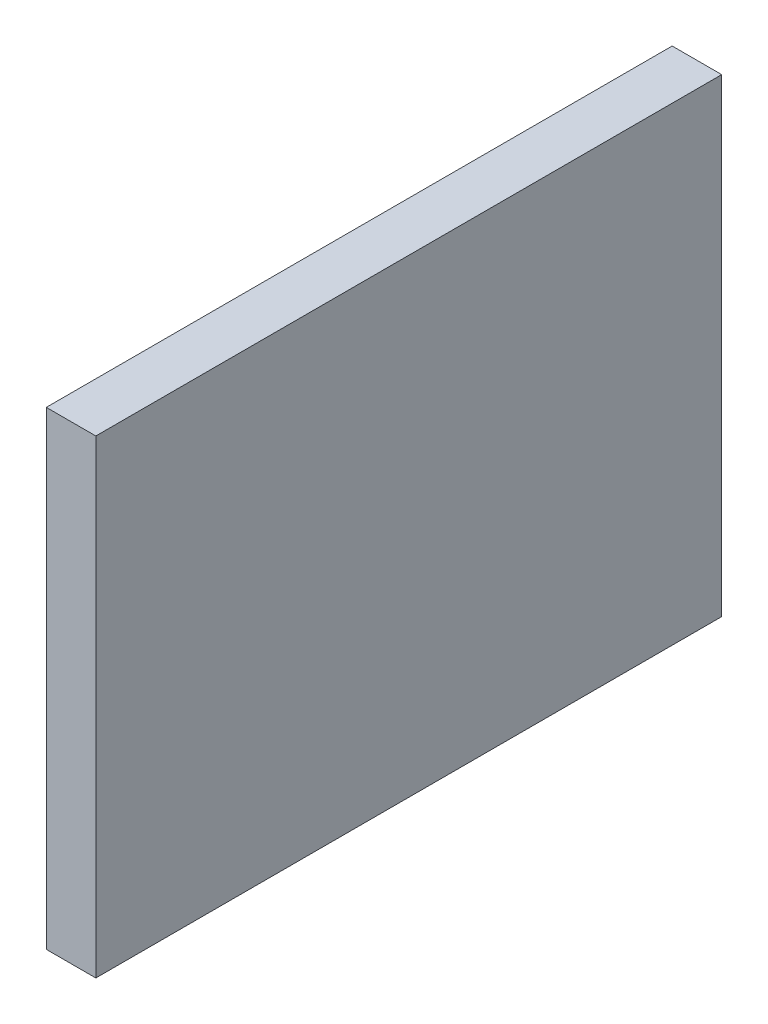
ISO-10303-21;
HEADER;
FILE_DESCRIPTION(('STEP AP214'),'2;1');
FILE_NAME('part.step','',(''),(''),'','','');
FILE_SCHEMA(('AUTOMOTIVE_DESIGN { 1 0 10303 214 1 1 1 1 }'));
ENDSEC;
DATA;
#1=APPLICATION_CONTEXT('core data for automotive mechanical design processes');
#2=APPLICATION_PROTOCOL_DEFINITION('international standard','automotive_design',2000,#1);
#3=PRODUCT_CONTEXT('',#1,'mechanical');
#4=PRODUCT('Part','Part','',(#3));
#5=PRODUCT_RELATED_PRODUCT_CATEGORY('part','',(#4));
#6=PRODUCT_DEFINITION_FORMATION('','',#4);
#7=PRODUCT_DEFINITION_CONTEXT('part definition',#1,'design');
#8=PRODUCT_DEFINITION('design','',#6,#7);
#9=PRODUCT_DEFINITION_SHAPE('','',#8);
#10=(LENGTH_UNIT() NAMED_UNIT(*) SI_UNIT(.MILLI.,.METRE.));
#11=(NAMED_UNIT(*) PLANE_ANGLE_UNIT() SI_UNIT($,.RADIAN.));
#12=(NAMED_UNIT(*) SI_UNIT($,.STERADIAN.) SOLID_ANGLE_UNIT());
#13=UNCERTAINTY_MEASURE_WITH_UNIT(LENGTH_MEASURE(1.E-05),#10,'distance_accuracy_value','');
#14=(GEOMETRIC_REPRESENTATION_CONTEXT(3) GLOBAL_UNCERTAINTY_ASSIGNED_CONTEXT((#13)) GLOBAL_UNIT_ASSIGNED_CONTEXT((#10,
#11,#12)) REPRESENTATION_CONTEXT('',''));
#15=CARTESIAN_POINT('',(0.,0.,0.));
#16=DIRECTION('',(0.,0.,1.));
#17=DIRECTION('',(1.,0.,0.));
#18=AXIS2_PLACEMENT_3D('',#15,#16,#17);
#19=CARTESIAN_POINT('',(9.5,-45.,-60.));
#20=DIRECTION('',(0.,0.,1.));
#21=DIRECTION('',(1.,0.,0.));
#22=AXIS2_PLACEMENT_3D('',#19,#20,#21);
#23=PLANE('',#22);
#24=DIRECTION('',(0.,1.,0.));
#25=VECTOR('',#24,1.);
#26=CARTESIAN_POINT('',(0.,-45.,-60.));
#27=LINE('',#26,#25);
#28=CARTESIAN_POINT('',(0.,-45.,-60.));
#29=VERTEX_POINT('',#28);
#30=CARTESIAN_POINT('',(0.,45.,-60.));
#31=VERTEX_POINT('',#30);
#32=EDGE_CURVE('E96',#29,#31,#27,.T.);
#33=ORIENTED_EDGE('',*,*,#32,.T.);
#34=DIRECTION('',(-1.,0.,0.));
#35=VECTOR('',#34,1.);
#36=CARTESIAN_POINT('',(9.5,45.,-60.));
#37=LINE('',#36,#35);
#38=CARTESIAN_POINT('',(9.5,45.,-60.));
#39=VERTEX_POINT('',#38);
#40=EDGE_CURVE('E11',#39,#31,#37,.T.);
#41=ORIENTED_EDGE('',*,*,#40,.F.);
#42=DIRECTION('',(0.,1.,0.));
#43=VECTOR('',#42,1.);
#44=CARTESIAN_POINT('',(9.5,-45.,-60.));
#45=LINE('',#44,#43);
#46=CARTESIAN_POINT('',(9.5,-45.,-60.));
#47=VERTEX_POINT('',#46);
#48=EDGE_CURVE('E84',#47,#39,#45,.T.);
#49=ORIENTED_EDGE('',*,*,#48,.F.);
#50=DIRECTION('',(-1.,0.,0.));
#51=VECTOR('',#50,1.);
#52=CARTESIAN_POINT('',(9.5,-45.,-60.));
#53=LINE('',#52,#51);
#54=EDGE_CURVE('E92',#47,#29,#53,.T.);
#55=ORIENTED_EDGE('',*,*,#54,.T.);
#56=EDGE_LOOP('',(#33,#41,#49,#55));
#57=FACE_BOUND('',#56,.T.);
#58=ADVANCED_FACE('F33',(#57),#23,.F.);
#59=CARTESIAN_POINT('',(9.5,45.,60.));
#60=DIRECTION('',(0.,-1.,0.));
#61=DIRECTION('',(0.,0.,-1.));
#62=AXIS2_PLACEMENT_3D('',#59,#60,#61);
#63=PLANE('',#62);
#64=DIRECTION('',(0.,0.,1.));
#65=VECTOR('',#64,1.);
#66=CARTESIAN_POINT('',(0.,45.,60.));
#67=LINE('',#66,#65);
#68=CARTESIAN_POINT('',(0.,45.,60.));
#69=VERTEX_POINT('',#68);
#70=EDGE_CURVE('E88',#31,#69,#67,.T.);
#71=ORIENTED_EDGE('',*,*,#70,.T.);
#72=DIRECTION('',(-1.,0.,0.));
#73=VECTOR('',#72,1.);
#74=CARTESIAN_POINT('',(9.5,45.,60.));
#75=LINE('',#74,#73);
#76=CARTESIAN_POINT('',(9.5,45.,60.));
#77=VERTEX_POINT('',#76);
#78=EDGE_CURVE('E41',#77,#69,#75,.T.);
#79=ORIENTED_EDGE('',*,*,#78,.F.);
#80=DIRECTION('',(0.,0.,1.));
#81=VECTOR('',#80,1.);
#82=CARTESIAN_POINT('',(9.5,45.,60.));
#83=LINE('',#82,#81);
#84=EDGE_CURVE('E79',#39,#77,#83,.T.);
#85=ORIENTED_EDGE('',*,*,#84,.F.);
#86=ORIENTED_EDGE('',*,*,#40,.T.);
#87=EDGE_LOOP('',(#71,#79,#85,#86));
#88=FACE_BOUND('',#87,.T.);
#89=ADVANCED_FACE('F87',(#88),#63,.F.);
#90=CARTESIAN_POINT('',(9.5,-45.,60.));
#91=DIRECTION('',(0.,0.,-1.));
#92=DIRECTION('',(-1.,0.,0.));
#93=AXIS2_PLACEMENT_3D('',#90,#91,#92);
#94=PLANE('',#93);
#95=DIRECTION('',(0.,-1.,0.));
#96=VECTOR('',#95,1.);
#97=CARTESIAN_POINT('',(0.,-45.,60.));
#98=LINE('',#97,#96);
#99=CARTESIAN_POINT('',(0.,-45.,60.));
#100=VERTEX_POINT('',#99);
#101=EDGE_CURVE('E66',#69,#100,#98,.T.);
#102=ORIENTED_EDGE('',*,*,#101,.T.);
#103=DIRECTION('',(-1.,0.,0.));
#104=VECTOR('',#103,1.);
#105=CARTESIAN_POINT('',(9.5,-45.,60.));
#106=LINE('',#105,#104);
#107=CARTESIAN_POINT('',(9.5,-45.,60.));
#108=VERTEX_POINT('',#107);
#109=EDGE_CURVE('E89',#108,#100,#106,.T.);
#110=ORIENTED_EDGE('',*,*,#109,.F.);
#111=DIRECTION('',(0.,-1.,0.));
#112=VECTOR('',#111,1.);
#113=CARTESIAN_POINT('',(9.5,-45.,60.));
#114=LINE('',#113,#112);
#115=EDGE_CURVE('E82',#77,#108,#114,.T.);
#116=ORIENTED_EDGE('',*,*,#115,.F.);
#117=ORIENTED_EDGE('',*,*,#78,.T.);
#118=EDGE_LOOP('',(#102,#110,#116,#117));
#119=FACE_BOUND('',#118,.T.);
#120=ADVANCED_FACE('F90',(#119),#94,.F.);
#121=CARTESIAN_POINT('',(9.5,-45.,60.));
#122=DIRECTION('',(0.,1.,0.));
#123=DIRECTION('',(0.,0.,1.));
#124=AXIS2_PLACEMENT_3D('',#121,#122,#123);
#125=PLANE('',#124);
#126=DIRECTION('',(0.,0.,-1.));
#127=VECTOR('',#126,1.);
#128=CARTESIAN_POINT('',(0.,-45.,60.));
#129=LINE('',#128,#127);
#130=EDGE_CURVE('E72',#100,#29,#129,.T.);
#131=ORIENTED_EDGE('',*,*,#130,.T.);
#132=ORIENTED_EDGE('',*,*,#54,.F.);
#133=DIRECTION('',(0.,0.,-1.));
#134=VECTOR('',#133,1.);
#135=CARTESIAN_POINT('',(9.5,-45.,60.));
#136=LINE('',#135,#134);
#137=EDGE_CURVE('E49',#108,#47,#136,.T.);
#138=ORIENTED_EDGE('',*,*,#137,.F.);
#139=ORIENTED_EDGE('',*,*,#109,.T.);
#140=EDGE_LOOP('',(#131,#132,#138,#139));
#141=FACE_BOUND('',#140,.T.);
#142=ADVANCED_FACE('F103',(#141),#125,.F.);
#143=CARTESIAN_POINT('',(9.5,0.,0.));
#144=DIRECTION('',(-1.,0.,0.));
#145=DIRECTION('',(0.,0.,1.));
#146=AXIS2_PLACEMENT_3D('',#143,#144,#145);
#147=PLANE('',#146);
#148=ORIENTED_EDGE('',*,*,#48,.T.);
#149=ORIENTED_EDGE('',*,*,#84,.T.);
#150=ORIENTED_EDGE('',*,*,#115,.T.);
#151=ORIENTED_EDGE('',*,*,#137,.T.);
#152=EDGE_LOOP('',(#148,#149,#150,#151));
#153=FACE_BOUND('',#152,.T.);
#154=ADVANCED_FACE('F80',(#153),#147,.F.);
#155=CARTESIAN_POINT('',(0.,0.,0.));
#156=DIRECTION('',(-1.,0.,0.));
#157=DIRECTION('',(0.,0.,1.));
#158=AXIS2_PLACEMENT_3D('',#155,#156,#157);
#159=PLANE('',#158);
#160=ORIENTED_EDGE('',*,*,#32,.F.);
#161=ORIENTED_EDGE('',*,*,#130,.F.);
#162=ORIENTED_EDGE('',*,*,#101,.F.);
#163=ORIENTED_EDGE('',*,*,#70,.F.);
#164=EDGE_LOOP('',(#160,#161,#162,#163));
#165=FACE_BOUND('',#164,.T.);
#166=ADVANCED_FACE('F106',(#165),#159,.T.);
#167=CLOSED_SHELL('',(#58,#89,#120,#142,#154,#166));
#168=MANIFOLD_SOLID_BREP('B2',#167);
#169=ADVANCED_BREP_SHAPE_REPRESENTATION('',(#18,#168),#14);
#170=SHAPE_DEFINITION_REPRESENTATION(#9,#169);
ENDSEC;
END-ISO-10303-21;
